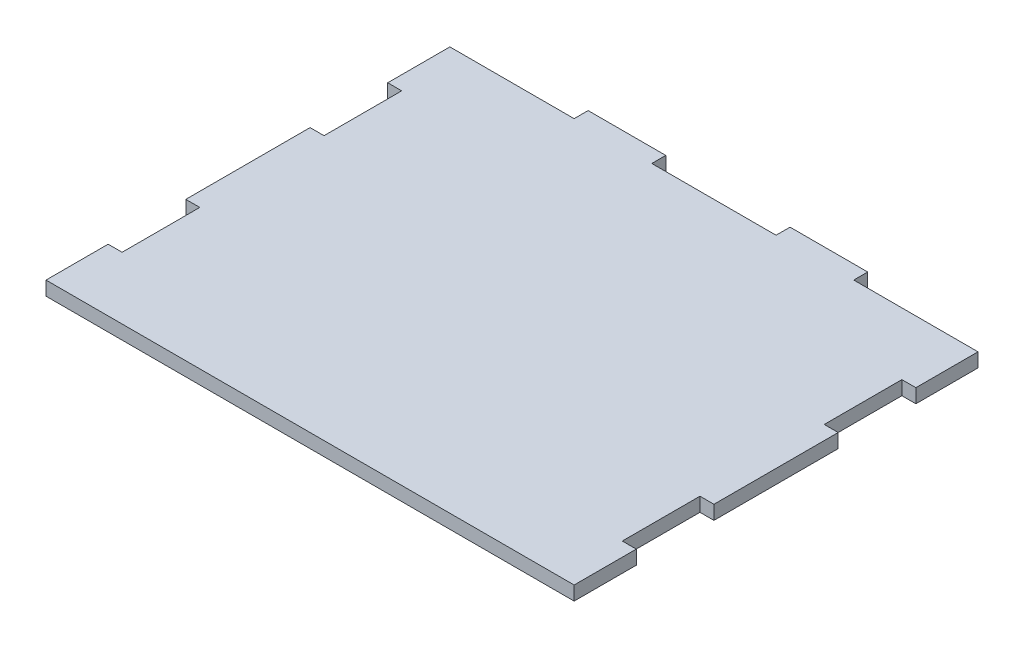
ISO-10303-21;
HEADER;
FILE_DESCRIPTION(('STEP AP214'),'2;1');
FILE_NAME('part.step','',(''),(''),'','','');
FILE_SCHEMA(('AUTOMOTIVE_DESIGN { 1 0 10303 214 1 1 1 1 }'));
ENDSEC;
DATA;
#1=APPLICATION_CONTEXT('core data for automotive mechanical design processes');
#2=APPLICATION_PROTOCOL_DEFINITION('international standard','automotive_design',2000,#1);
#3=PRODUCT_CONTEXT('',#1,'mechanical');
#4=PRODUCT('Part','Part','',(#3));
#5=PRODUCT_RELATED_PRODUCT_CATEGORY('part','',(#4));
#6=PRODUCT_DEFINITION_FORMATION('','',#4);
#7=PRODUCT_DEFINITION_CONTEXT('part definition',#1,'design');
#8=PRODUCT_DEFINITION('design','',#6,#7);
#9=PRODUCT_DEFINITION_SHAPE('','',#8);
#10=(LENGTH_UNIT() NAMED_UNIT(*) SI_UNIT(.MILLI.,.METRE.));
#11=(NAMED_UNIT(*) PLANE_ANGLE_UNIT() SI_UNIT($,.RADIAN.));
#12=(NAMED_UNIT(*) SI_UNIT($,.STERADIAN.) SOLID_ANGLE_UNIT());
#13=UNCERTAINTY_MEASURE_WITH_UNIT(LENGTH_MEASURE(1.E-05),#10,'distance_accuracy_value','');
#14=(GEOMETRIC_REPRESENTATION_CONTEXT(3) GLOBAL_UNCERTAINTY_ASSIGNED_CONTEXT((#13)) GLOBAL_UNIT_ASSIGNED_CONTEXT((#10,
#11,#12)) REPRESENTATION_CONTEXT('',''));
#15=CARTESIAN_POINT('',(0.,0.,0.));
#16=DIRECTION('',(0.,0.,1.));
#17=DIRECTION('',(1.,0.,0.));
#18=AXIS2_PLACEMENT_3D('',#15,#16,#17);
#19=CARTESIAN_POINT('',(-91.4466292134831,4.5,-35.6952247191011));
#20=DIRECTION('',(1.,0.,0.));
#21=DIRECTION('',(0.,0.,-1.));
#22=AXIS2_PLACEMENT_3D('',#19,#20,#21);
#23=PLANE('',#22);
#24=DIRECTION('',(0.,0.,1.));
#25=VECTOR('',#24,1.);
#26=CARTESIAN_POINT('',(-91.4466292134831,0.,-35.6952247191011));
#27=LINE('',#26,#25);
#28=CARTESIAN_POINT('',(-91.4466292134831,0.,-35.6952247191011));
#29=VERTEX_POINT('',#28);
#30=CARTESIAN_POINT('',(-91.4466292134831,0.,-15.6952247191011));
#31=VERTEX_POINT('',#30);
#32=EDGE_CURVE('E249',#29,#31,#27,.T.);
#33=ORIENTED_EDGE('',*,*,#32,.T.);
#34=DIRECTION('',(0.,-1.,0.));
#35=VECTOR('',#34,1.);
#36=CARTESIAN_POINT('',(-91.4466292134831,4.5,-15.6952247191011));
#37=LINE('',#36,#35);
#38=CARTESIAN_POINT('',(-91.4466292134831,4.5,-15.6952247191011));
#39=VERTEX_POINT('',#38);
#40=EDGE_CURVE('E11',#39,#31,#37,.T.);
#41=ORIENTED_EDGE('',*,*,#40,.F.);
#42=DIRECTION('',(0.,0.,1.));
#43=VECTOR('',#42,1.);
#44=CARTESIAN_POINT('',(-91.4466292134831,4.5,-35.6952247191011));
#45=LINE('',#44,#43);
#46=CARTESIAN_POINT('',(-91.4466292134831,4.5,-35.6952247191011));
#47=VERTEX_POINT('',#46);
#48=EDGE_CURVE('E303',#47,#39,#45,.T.);
#49=ORIENTED_EDGE('',*,*,#48,.F.);
#50=DIRECTION('',(0.,-1.,0.));
#51=VECTOR('',#50,1.);
#52=CARTESIAN_POINT('',(-91.4466292134831,4.5,-35.6952247191011));
#53=LINE('',#52,#51);
#54=EDGE_CURVE('E245',#47,#29,#53,.T.);
#55=ORIENTED_EDGE('',*,*,#54,.T.);
#56=EDGE_LOOP('',(#33,#41,#49,#55));
#57=FACE_BOUND('',#56,.T.);
#58=ADVANCED_FACE('F33',(#57),#23,.F.);
#59=CARTESIAN_POINT('',(-91.4466292134831,4.5,-15.6952247191011));
#60=DIRECTION('',(0.,0.,-1.));
#61=DIRECTION('',(-1.,0.,0.));
#62=AXIS2_PLACEMENT_3D('',#59,#60,#61);
#63=PLANE('',#62);
#64=DIRECTION('',(1.,0.,0.));
#65=VECTOR('',#64,1.);
#66=CARTESIAN_POINT('',(-91.4466292134831,0.,-15.6952247191011));
#67=LINE('',#66,#65);
#68=CARTESIAN_POINT('',(-86.9466292134831,0.,-15.6952247191011));
#69=VERTEX_POINT('',#68);
#70=EDGE_CURVE('E252',#31,#69,#67,.T.);
#71=ORIENTED_EDGE('',*,*,#70,.T.);
#72=DIRECTION('',(0.,-1.,0.));
#73=VECTOR('',#72,1.);
#74=CARTESIAN_POINT('',(-86.9466292134831,4.5,-15.6952247191011));
#75=LINE('',#74,#73);
#76=CARTESIAN_POINT('',(-86.9466292134831,4.5,-15.6952247191011));
#77=VERTEX_POINT('',#76);
#78=EDGE_CURVE('E41',#77,#69,#75,.T.);
#79=ORIENTED_EDGE('',*,*,#78,.F.);
#80=DIRECTION('',(1.,0.,0.));
#81=VECTOR('',#80,1.);
#82=CARTESIAN_POINT('',(-91.4466292134831,4.5,-15.6952247191011));
#83=LINE('',#82,#81);
#84=EDGE_CURVE('E152',#39,#77,#83,.T.);
#85=ORIENTED_EDGE('',*,*,#84,.F.);
#86=ORIENTED_EDGE('',*,*,#40,.T.);
#87=EDGE_LOOP('',(#71,#79,#85,#86));
#88=FACE_BOUND('',#87,.T.);
#89=ADVANCED_FACE('F461',(#88),#63,.F.);
#90=CARTESIAN_POINT('',(-86.9466292134831,4.5,-15.6952247191011));
#91=DIRECTION('',(1.,0.,0.));
#92=DIRECTION('',(0.,0.,-1.));
#93=AXIS2_PLACEMENT_3D('',#90,#91,#92);
#94=PLANE('',#93);
#95=DIRECTION('',(0.,0.,1.));
#96=VECTOR('',#95,1.);
#97=CARTESIAN_POINT('',(-86.9466292134831,0.,-15.6952247191011));
#98=LINE('',#97,#96);
#99=CARTESIAN_POINT('',(-86.9466292134831,0.,9.30477528089887));
#100=VERTEX_POINT('',#99);
#101=EDGE_CURVE('E254',#69,#100,#98,.T.);
#102=ORIENTED_EDGE('',*,*,#101,.T.);
#103=DIRECTION('',(0.,-1.,0.));
#104=VECTOR('',#103,1.);
#105=CARTESIAN_POINT('',(-86.9466292134831,4.5,9.30477528089887));
#106=LINE('',#105,#104);
#107=CARTESIAN_POINT('',(-86.9466292134831,4.5,9.30477528089887));
#108=VERTEX_POINT('',#107);
#109=EDGE_CURVE('E370',#108,#100,#106,.T.);
#110=ORIENTED_EDGE('',*,*,#109,.F.);
#111=DIRECTION('',(0.,0.,1.));
#112=VECTOR('',#111,1.);
#113=CARTESIAN_POINT('',(-86.9466292134831,4.5,-15.6952247191011));
#114=LINE('',#113,#112);
#115=EDGE_CURVE('E378',#77,#108,#114,.T.);
#116=ORIENTED_EDGE('',*,*,#115,.F.);
#117=ORIENTED_EDGE('',*,*,#78,.T.);
#118=EDGE_LOOP('',(#102,#110,#116,#117));
#119=FACE_BOUND('',#118,.T.);
#120=ADVANCED_FACE('F376',(#119),#94,.F.);
#121=CARTESIAN_POINT('',(-91.4466292134832,4.5,9.30477528089887));
#122=DIRECTION('',(0.,0.,1.));
#123=DIRECTION('',(1.,0.,0.));
#124=AXIS2_PLACEMENT_3D('',#121,#122,#123);
#125=PLANE('',#124);
#126=DIRECTION('',(-1.,0.,0.));
#127=VECTOR('',#126,1.);
#128=CARTESIAN_POINT('',(-91.4466292134832,0.,9.30477528089887));
#129=LINE('',#128,#127);
#130=CARTESIAN_POINT('',(-91.4466292134832,0.,9.30477528089887));
#131=VERTEX_POINT('',#130);
#132=EDGE_CURVE('E256',#100,#131,#129,.T.);
#133=ORIENTED_EDGE('',*,*,#132,.T.);
#134=DIRECTION('',(0.,-1.,0.));
#135=VECTOR('',#134,1.);
#136=CARTESIAN_POINT('',(-91.4466292134832,4.5,9.30477528089887));
#137=LINE('',#136,#135);
#138=CARTESIAN_POINT('',(-91.4466292134832,4.5,9.30477528089887));
#139=VERTEX_POINT('',#138);
#140=EDGE_CURVE('E367',#139,#131,#137,.T.);
#141=ORIENTED_EDGE('',*,*,#140,.F.);
#142=DIRECTION('',(-1.,0.,0.));
#143=VECTOR('',#142,1.);
#144=CARTESIAN_POINT('',(-91.4466292134832,4.5,9.30477528089887));
#145=LINE('',#144,#143);
#146=EDGE_CURVE('E396',#108,#139,#145,.T.);
#147=ORIENTED_EDGE('',*,*,#146,.F.);
#148=ORIENTED_EDGE('',*,*,#109,.T.);
#149=EDGE_LOOP('',(#133,#141,#147,#148));
#150=FACE_BOUND('',#149,.T.);
#151=ADVANCED_FACE('F387',(#150),#125,.F.);
#152=CARTESIAN_POINT('',(-91.4466292134832,4.5,9.30477528089887));
#153=DIRECTION('',(1.,0.,0.));
#154=DIRECTION('',(0.,0.,-1.));
#155=AXIS2_PLACEMENT_3D('',#152,#153,#154);
#156=PLANE('',#155);
#157=DIRECTION('',(0.,0.,1.));
#158=VECTOR('',#157,1.);
#159=CARTESIAN_POINT('',(-91.4466292134832,0.,9.30477528089887));
#160=LINE('',#159,#158);
#161=CARTESIAN_POINT('',(-91.4466292134832,0.,49.3047752808989));
#162=VERTEX_POINT('',#161);
#163=EDGE_CURVE('E258',#131,#162,#160,.T.);
#164=ORIENTED_EDGE('',*,*,#163,.T.);
#165=DIRECTION('',(0.,-1.,0.));
#166=VECTOR('',#165,1.);
#167=CARTESIAN_POINT('',(-91.4466292134832,4.5,49.3047752808989));
#168=LINE('',#167,#166);
#169=CARTESIAN_POINT('',(-91.4466292134832,4.5,49.3047752808989));
#170=VERTEX_POINT('',#169);
#171=EDGE_CURVE('E364',#170,#162,#168,.T.);
#172=ORIENTED_EDGE('',*,*,#171,.F.);
#173=DIRECTION('',(0.,0.,1.));
#174=VECTOR('',#173,1.);
#175=CARTESIAN_POINT('',(-91.4466292134832,4.5,9.30477528089887));
#176=LINE('',#175,#174);
#177=EDGE_CURVE('E393',#139,#170,#176,.T.);
#178=ORIENTED_EDGE('',*,*,#177,.F.);
#179=ORIENTED_EDGE('',*,*,#140,.T.);
#180=EDGE_LOOP('',(#164,#172,#178,#179));
#181=FACE_BOUND('',#180,.T.);
#182=ADVANCED_FACE('F391',(#181),#156,.F.);
#183=CARTESIAN_POINT('',(-91.4466292134832,4.5,49.3047752808989));
#184=DIRECTION('',(0.,0.,-1.));
#185=DIRECTION('',(-1.,0.,0.));
#186=AXIS2_PLACEMENT_3D('',#183,#184,#185);
#187=PLANE('',#186);
#188=DIRECTION('',(1.,0.,0.));
#189=VECTOR('',#188,1.);
#190=CARTESIAN_POINT('',(-91.4466292134832,0.,49.3047752808989));
#191=LINE('',#190,#189);
#192=CARTESIAN_POINT('',(-86.9466292134831,0.,49.3047752808989));
#193=VERTEX_POINT('',#192);
#194=EDGE_CURVE('E260',#162,#193,#191,.T.);
#195=ORIENTED_EDGE('',*,*,#194,.T.);
#196=DIRECTION('',(0.,-1.,0.));
#197=VECTOR('',#196,1.);
#198=CARTESIAN_POINT('',(-86.9466292134831,4.5,49.3047752808989));
#199=LINE('',#198,#197);
#200=CARTESIAN_POINT('',(-86.9466292134831,4.5,49.3047752808989));
#201=VERTEX_POINT('',#200);
#202=EDGE_CURVE('E361',#201,#193,#199,.T.);
#203=ORIENTED_EDGE('',*,*,#202,.F.);
#204=DIRECTION('',(1.,0.,0.));
#205=VECTOR('',#204,1.);
#206=CARTESIAN_POINT('',(-91.4466292134832,4.5,49.3047752808989));
#207=LINE('',#206,#205);
#208=EDGE_CURVE('E395',#170,#201,#207,.T.);
#209=ORIENTED_EDGE('',*,*,#208,.F.);
#210=ORIENTED_EDGE('',*,*,#171,.T.);
#211=EDGE_LOOP('',(#195,#203,#209,#210));
#212=FACE_BOUND('',#211,.T.);
#213=ADVANCED_FACE('F474',(#212),#187,.F.);
#214=CARTESIAN_POINT('',(-86.9466292134831,4.5,74.3047752808989));
#215=DIRECTION('',(1.,0.,0.));
#216=DIRECTION('',(0.,0.,-1.));
#217=AXIS2_PLACEMENT_3D('',#214,#215,#216);
#218=PLANE('',#217);
#219=DIRECTION('',(0.,0.,1.));
#220=VECTOR('',#219,1.);
#221=CARTESIAN_POINT('',(-86.9466292134831,0.,74.3047752808989));
#222=LINE('',#221,#220);
#223=CARTESIAN_POINT('',(-86.9466292134831,0.,74.3047752808989));
#224=VERTEX_POINT('',#223);
#225=EDGE_CURVE('E262',#193,#224,#222,.T.);
#226=ORIENTED_EDGE('',*,*,#225,.T.);
#227=DIRECTION('',(0.,-1.,0.));
#228=VECTOR('',#227,1.);
#229=CARTESIAN_POINT('',(-86.9466292134831,4.5,74.3047752808989));
#230=LINE('',#229,#228);
#231=CARTESIAN_POINT('',(-86.9466292134831,4.5,74.3047752808989));
#232=VERTEX_POINT('',#231);
#233=EDGE_CURVE('E358',#232,#224,#230,.T.);
#234=ORIENTED_EDGE('',*,*,#233,.F.);
#235=DIRECTION('',(0.,0.,1.));
#236=VECTOR('',#235,1.);
#237=CARTESIAN_POINT('',(-86.9466292134831,4.5,74.3047752808989));
#238=LINE('',#237,#236);
#239=EDGE_CURVE('E398',#201,#232,#238,.T.);
#240=ORIENTED_EDGE('',*,*,#239,.F.);
#241=ORIENTED_EDGE('',*,*,#202,.T.);
#242=EDGE_LOOP('',(#226,#234,#240,#241));
#243=FACE_BOUND('',#242,.T.);
#244=ADVANCED_FACE('F477',(#243),#218,.F.);
#245=CARTESIAN_POINT('',(-91.4466292134831,4.5,74.3047752808989));
#246=DIRECTION('',(0.,0.,1.));
#247=DIRECTION('',(1.,0.,0.));
#248=AXIS2_PLACEMENT_3D('',#245,#246,#247);
#249=PLANE('',#248);
#250=DIRECTION('',(-1.,0.,0.));
#251=VECTOR('',#250,1.);
#252=CARTESIAN_POINT('',(-91.4466292134831,0.,74.3047752808989));
#253=LINE('',#252,#251);
#254=CARTESIAN_POINT('',(-91.4466292134831,0.,74.3047752808989));
#255=VERTEX_POINT('',#254);
#256=EDGE_CURVE('E264',#224,#255,#253,.T.);
#257=ORIENTED_EDGE('',*,*,#256,.T.);
#258=DIRECTION('',(0.,-1.,0.));
#259=VECTOR('',#258,1.);
#260=CARTESIAN_POINT('',(-91.4466292134831,4.5,74.3047752808989));
#261=LINE('',#260,#259);
#262=CARTESIAN_POINT('',(-91.4466292134831,4.5,74.3047752808989));
#263=VERTEX_POINT('',#262);
#264=EDGE_CURVE('E355',#263,#255,#261,.T.);
#265=ORIENTED_EDGE('',*,*,#264,.F.);
#266=DIRECTION('',(-1.,0.,0.));
#267=VECTOR('',#266,1.);
#268=CARTESIAN_POINT('',(-91.4466292134831,4.5,74.3047752808989));
#269=LINE('',#268,#267);
#270=EDGE_CURVE('E404',#232,#263,#269,.T.);
#271=ORIENTED_EDGE('',*,*,#270,.F.);
#272=ORIENTED_EDGE('',*,*,#233,.T.);
#273=EDGE_LOOP('',(#257,#265,#271,#272));
#274=FACE_BOUND('',#273,.T.);
#275=ADVANCED_FACE('F481',(#274),#249,.F.);
#276=CARTESIAN_POINT('',(-91.4466292134831,4.5,74.3047752808989));
#277=DIRECTION('',(1.,0.,0.));
#278=DIRECTION('',(0.,0.,-1.));
#279=AXIS2_PLACEMENT_3D('',#276,#277,#278);
#280=PLANE('',#279);
#281=DIRECTION('',(0.,0.,1.));
#282=VECTOR('',#281,1.);
#283=CARTESIAN_POINT('',(-91.4466292134831,0.,74.3047752808989));
#284=LINE('',#283,#282);
#285=CARTESIAN_POINT('',(-91.4466292134831,0.,94.3047752808989));
#286=VERTEX_POINT('',#285);
#287=EDGE_CURVE('E266',#255,#286,#284,.T.);
#288=ORIENTED_EDGE('',*,*,#287,.T.);
#289=DIRECTION('',(0.,-1.,0.));
#290=VECTOR('',#289,1.);
#291=CARTESIAN_POINT('',(-91.4466292134831,4.5,94.3047752808989));
#292=LINE('',#291,#290);
#293=CARTESIAN_POINT('',(-91.4466292134831,4.5,94.3047752808989));
#294=VERTEX_POINT('',#293);
#295=EDGE_CURVE('E352',#294,#286,#292,.T.);
#296=ORIENTED_EDGE('',*,*,#295,.F.);
#297=DIRECTION('',(0.,0.,1.));
#298=VECTOR('',#297,1.);
#299=CARTESIAN_POINT('',(-91.4466292134831,4.5,74.3047752808989));
#300=LINE('',#299,#298);
#301=EDGE_CURVE('E406',#263,#294,#300,.T.);
#302=ORIENTED_EDGE('',*,*,#301,.F.);
#303=ORIENTED_EDGE('',*,*,#264,.T.);
#304=EDGE_LOOP('',(#288,#296,#302,#303));
#305=FACE_BOUND('',#304,.T.);
#306=ADVANCED_FACE('F485',(#305),#280,.F.);
#307=CARTESIAN_POINT('',(-91.4466292134831,4.5,94.3047752808989));
#308=DIRECTION('',(0.,0.,-1.));
#309=DIRECTION('',(-1.,0.,0.));
#310=AXIS2_PLACEMENT_3D('',#307,#308,#309);
#311=PLANE('',#310);
#312=DIRECTION('',(1.,0.,0.));
#313=VECTOR('',#312,1.);
#314=CARTESIAN_POINT('',(-91.4466292134831,0.,94.3047752808989));
#315=LINE('',#314,#313);
#316=CARTESIAN_POINT('',(78.5533707865169,0.,94.3047752808989));
#317=VERTEX_POINT('',#316);
#318=EDGE_CURVE('E268',#286,#317,#315,.T.);
#319=ORIENTED_EDGE('',*,*,#318,.T.);
#320=DIRECTION('',(0.,-1.,0.));
#321=VECTOR('',#320,1.);
#322=CARTESIAN_POINT('',(78.5533707865169,4.5,94.3047752808989));
#323=LINE('',#322,#321);
#324=CARTESIAN_POINT('',(78.5533707865169,4.5,94.3047752808989));
#325=VERTEX_POINT('',#324);
#326=EDGE_CURVE('E349',#325,#317,#323,.T.);
#327=ORIENTED_EDGE('',*,*,#326,.F.);
#328=DIRECTION('',(1.,0.,0.));
#329=VECTOR('',#328,1.);
#330=CARTESIAN_POINT('',(-91.4466292134831,4.5,94.3047752808989));
#331=LINE('',#330,#329);
#332=EDGE_CURVE('E408',#294,#325,#331,.T.);
#333=ORIENTED_EDGE('',*,*,#332,.F.);
#334=ORIENTED_EDGE('',*,*,#295,.T.);
#335=EDGE_LOOP('',(#319,#327,#333,#334));
#336=FACE_BOUND('',#335,.T.);
#337=ADVANCED_FACE('F489',(#336),#311,.F.);
#338=CARTESIAN_POINT('',(78.5533707865169,4.5,74.3047752808988));
#339=DIRECTION('',(-1.,0.,0.));
#340=DIRECTION('',(0.,0.,1.));
#341=AXIS2_PLACEMENT_3D('',#338,#339,#340);
#342=PLANE('',#341);
#343=DIRECTION('',(0.,0.,-1.));
#344=VECTOR('',#343,1.);
#345=CARTESIAN_POINT('',(78.5533707865169,0.,74.3047752808988));
#346=LINE('',#345,#344);
#347=CARTESIAN_POINT('',(78.5533707865169,0.,74.3047752808988));
#348=VERTEX_POINT('',#347);
#349=EDGE_CURVE('E270',#317,#348,#346,.T.);
#350=ORIENTED_EDGE('',*,*,#349,.T.);
#351=DIRECTION('',(0.,-1.,0.));
#352=VECTOR('',#351,1.);
#353=CARTESIAN_POINT('',(78.5533707865169,4.5,74.3047752808988));
#354=LINE('',#353,#352);
#355=CARTESIAN_POINT('',(78.5533707865169,4.5,74.3047752808988));
#356=VERTEX_POINT('',#355);
#357=EDGE_CURVE('E346',#356,#348,#354,.T.);
#358=ORIENTED_EDGE('',*,*,#357,.F.);
#359=DIRECTION('',(0.,0.,-1.));
#360=VECTOR('',#359,1.);
#361=CARTESIAN_POINT('',(78.5533707865169,4.5,74.3047752808988));
#362=LINE('',#361,#360);
#363=EDGE_CURVE('E410',#325,#356,#362,.T.);
#364=ORIENTED_EDGE('',*,*,#363,.F.);
#365=ORIENTED_EDGE('',*,*,#326,.T.);
#366=EDGE_LOOP('',(#350,#358,#364,#365));
#367=FACE_BOUND('',#366,.T.);
#368=ADVANCED_FACE('F493',(#367),#342,.F.);
#369=CARTESIAN_POINT('',(78.5533707865169,4.5,74.3047752808988));
#370=DIRECTION('',(0.,0.,1.));
#371=DIRECTION('',(1.,0.,0.));
#372=AXIS2_PLACEMENT_3D('',#369,#370,#371);
#373=PLANE('',#372);
#374=DIRECTION('',(-1.,0.,0.));
#375=VECTOR('',#374,1.);
#376=CARTESIAN_POINT('',(78.5533707865169,0.,74.3047752808988));
#377=LINE('',#376,#375);
#378=CARTESIAN_POINT('',(74.0533707865169,0.,74.3047752808988));
#379=VERTEX_POINT('',#378);
#380=EDGE_CURVE('E272',#348,#379,#377,.T.);
#381=ORIENTED_EDGE('',*,*,#380,.T.);
#382=DIRECTION('',(0.,-1.,0.));
#383=VECTOR('',#382,1.);
#384=CARTESIAN_POINT('',(74.0533707865169,4.5,74.3047752808988));
#385=LINE('',#384,#383);
#386=CARTESIAN_POINT('',(74.0533707865169,4.5,74.3047752808988));
#387=VERTEX_POINT('',#386);
#388=EDGE_CURVE('E343',#387,#379,#385,.T.);
#389=ORIENTED_EDGE('',*,*,#388,.F.);
#390=DIRECTION('',(-1.,0.,0.));
#391=VECTOR('',#390,1.);
#392=CARTESIAN_POINT('',(78.5533707865169,4.5,74.3047752808988));
#393=LINE('',#392,#391);
#394=EDGE_CURVE('E412',#356,#387,#393,.T.);
#395=ORIENTED_EDGE('',*,*,#394,.F.);
#396=ORIENTED_EDGE('',*,*,#357,.T.);
#397=EDGE_LOOP('',(#381,#389,#395,#396));
#398=FACE_BOUND('',#397,.T.);
#399=ADVANCED_FACE('F497',(#398),#373,.F.);
#400=CARTESIAN_POINT('',(74.0533707865169,4.5,74.3047752808988));
#401=DIRECTION('',(-1.,0.,0.));
#402=DIRECTION('',(0.,0.,1.));
#403=AXIS2_PLACEMENT_3D('',#400,#401,#402);
#404=PLANE('',#403);
#405=DIRECTION('',(0.,0.,-1.));
#406=VECTOR('',#405,1.);
#407=CARTESIAN_POINT('',(74.0533707865169,0.,74.3047752808988));
#408=LINE('',#407,#406);
#409=CARTESIAN_POINT('',(74.0533707865169,0.,49.3047752808988));
#410=VERTEX_POINT('',#409);
#411=EDGE_CURVE('E274',#379,#410,#408,.T.);
#412=ORIENTED_EDGE('',*,*,#411,.T.);
#413=DIRECTION('',(0.,-1.,0.));
#414=VECTOR('',#413,1.);
#415=CARTESIAN_POINT('',(74.0533707865169,4.5,49.3047752808988));
#416=LINE('',#415,#414);
#417=CARTESIAN_POINT('',(74.0533707865169,4.5,49.3047752808988));
#418=VERTEX_POINT('',#417);
#419=EDGE_CURVE('E340',#418,#410,#416,.T.);
#420=ORIENTED_EDGE('',*,*,#419,.F.);
#421=DIRECTION('',(0.,0.,-1.));
#422=VECTOR('',#421,1.);
#423=CARTESIAN_POINT('',(74.0533707865169,4.5,74.3047752808988));
#424=LINE('',#423,#422);
#425=EDGE_CURVE('E414',#387,#418,#424,.T.);
#426=ORIENTED_EDGE('',*,*,#425,.F.);
#427=ORIENTED_EDGE('',*,*,#388,.T.);
#428=EDGE_LOOP('',(#412,#420,#426,#427));
#429=FACE_BOUND('',#428,.T.);
#430=ADVANCED_FACE('F501',(#429),#404,.F.);
#431=CARTESIAN_POINT('',(78.5533707865169,4.5,49.3047752808988));
#432=DIRECTION('',(0.,0.,-1.));
#433=DIRECTION('',(-1.,0.,0.));
#434=AXIS2_PLACEMENT_3D('',#431,#432,#433);
#435=PLANE('',#434);
#436=DIRECTION('',(1.,0.,0.));
#437=VECTOR('',#436,1.);
#438=CARTESIAN_POINT('',(78.5533707865169,0.,49.3047752808988));
#439=LINE('',#438,#437);
#440=CARTESIAN_POINT('',(78.5533707865169,0.,49.3047752808988));
#441=VERTEX_POINT('',#440);
#442=EDGE_CURVE('E276',#410,#441,#439,.T.);
#443=ORIENTED_EDGE('',*,*,#442,.T.);
#444=DIRECTION('',(0.,-1.,0.));
#445=VECTOR('',#444,1.);
#446=CARTESIAN_POINT('',(78.5533707865169,4.5,49.3047752808988));
#447=LINE('',#446,#445);
#448=CARTESIAN_POINT('',(78.5533707865169,4.5,49.3047752808988));
#449=VERTEX_POINT('',#448);
#450=EDGE_CURVE('E337',#449,#441,#447,.T.);
#451=ORIENTED_EDGE('',*,*,#450,.F.);
#452=DIRECTION('',(1.,0.,0.));
#453=VECTOR('',#452,1.);
#454=CARTESIAN_POINT('',(78.5533707865169,4.5,49.3047752808988));
#455=LINE('',#454,#453);
#456=EDGE_CURVE('E416',#418,#449,#455,.T.);
#457=ORIENTED_EDGE('',*,*,#456,.F.);
#458=ORIENTED_EDGE('',*,*,#419,.T.);
#459=EDGE_LOOP('',(#443,#451,#457,#458));
#460=FACE_BOUND('',#459,.T.);
#461=ADVANCED_FACE('F505',(#460),#435,.F.);
#462=CARTESIAN_POINT('',(78.5533707865169,4.5,9.30477528089885));
#463=DIRECTION('',(-1.,0.,0.));
#464=DIRECTION('',(0.,0.,1.));
#465=AXIS2_PLACEMENT_3D('',#462,#463,#464);
#466=PLANE('',#465);
#467=DIRECTION('',(0.,0.,-1.));
#468=VECTOR('',#467,1.);
#469=CARTESIAN_POINT('',(78.5533707865169,0.,9.30477528089885));
#470=LINE('',#469,#468);
#471=CARTESIAN_POINT('',(78.5533707865169,0.,9.30477528089885));
#472=VERTEX_POINT('',#471);
#473=EDGE_CURVE('E278',#441,#472,#470,.T.);
#474=ORIENTED_EDGE('',*,*,#473,.T.);
#475=DIRECTION('',(0.,-1.,0.));
#476=VECTOR('',#475,1.);
#477=CARTESIAN_POINT('',(78.5533707865169,4.5,9.30477528089885));
#478=LINE('',#477,#476);
#479=CARTESIAN_POINT('',(78.5533707865169,4.5,9.30477528089885));
#480=VERTEX_POINT('',#479);
#481=EDGE_CURVE('E334',#480,#472,#478,.T.);
#482=ORIENTED_EDGE('',*,*,#481,.F.);
#483=DIRECTION('',(0.,0.,-1.));
#484=VECTOR('',#483,1.);
#485=CARTESIAN_POINT('',(78.5533707865169,4.5,9.30477528089885));
#486=LINE('',#485,#484);
#487=EDGE_CURVE('E418',#449,#480,#486,.T.);
#488=ORIENTED_EDGE('',*,*,#487,.F.);
#489=ORIENTED_EDGE('',*,*,#450,.T.);
#490=EDGE_LOOP('',(#474,#482,#488,#489));
#491=FACE_BOUND('',#490,.T.);
#492=ADVANCED_FACE('F509',(#491),#466,.F.);
#493=CARTESIAN_POINT('',(78.5533707865169,4.5,9.30477528089885));
#494=DIRECTION('',(0.,0.,1.));
#495=DIRECTION('',(1.,0.,0.));
#496=AXIS2_PLACEMENT_3D('',#493,#494,#495);
#497=PLANE('',#496);
#498=DIRECTION('',(-1.,0.,0.));
#499=VECTOR('',#498,1.);
#500=CARTESIAN_POINT('',(78.5533707865169,0.,9.30477528089885));
#501=LINE('',#500,#499);
#502=CARTESIAN_POINT('',(74.0533707865169,0.,9.30477528089885));
#503=VERTEX_POINT('',#502);
#504=EDGE_CURVE('E280',#472,#503,#501,.T.);
#505=ORIENTED_EDGE('',*,*,#504,.T.);
#506=DIRECTION('',(0.,-1.,0.));
#507=VECTOR('',#506,1.);
#508=CARTESIAN_POINT('',(74.0533707865169,4.5,9.30477528089885));
#509=LINE('',#508,#507);
#510=CARTESIAN_POINT('',(74.0533707865169,4.5,9.30477528089885));
#511=VERTEX_POINT('',#510);
#512=EDGE_CURVE('E331',#511,#503,#509,.T.);
#513=ORIENTED_EDGE('',*,*,#512,.F.);
#514=DIRECTION('',(-1.,0.,0.));
#515=VECTOR('',#514,1.);
#516=CARTESIAN_POINT('',(78.5533707865169,4.5,9.30477528089885));
#517=LINE('',#516,#515);
#518=EDGE_CURVE('E420',#480,#511,#517,.T.);
#519=ORIENTED_EDGE('',*,*,#518,.F.);
#520=ORIENTED_EDGE('',*,*,#481,.T.);
#521=EDGE_LOOP('',(#505,#513,#519,#520));
#522=FACE_BOUND('',#521,.T.);
#523=ADVANCED_FACE('F513',(#522),#497,.F.);
#524=CARTESIAN_POINT('',(74.0533707865169,4.5,-15.6952247191011));
#525=DIRECTION('',(-1.,0.,0.));
#526=DIRECTION('',(0.,0.,1.));
#527=AXIS2_PLACEMENT_3D('',#524,#525,#526);
#528=PLANE('',#527);
#529=DIRECTION('',(0.,0.,-1.));
#530=VECTOR('',#529,1.);
#531=CARTESIAN_POINT('',(74.0533707865169,0.,-15.6952247191011));
#532=LINE('',#531,#530);
#533=CARTESIAN_POINT('',(74.0533707865169,0.,-15.6952247191011));
#534=VERTEX_POINT('',#533);
#535=EDGE_CURVE('E282',#503,#534,#532,.T.);
#536=ORIENTED_EDGE('',*,*,#535,.T.);
#537=DIRECTION('',(0.,-1.,0.));
#538=VECTOR('',#537,1.);
#539=CARTESIAN_POINT('',(74.0533707865169,4.5,-15.6952247191011));
#540=LINE('',#539,#538);
#541=CARTESIAN_POINT('',(74.0533707865169,4.5,-15.6952247191011));
#542=VERTEX_POINT('',#541);
#543=EDGE_CURVE('E328',#542,#534,#540,.T.);
#544=ORIENTED_EDGE('',*,*,#543,.F.);
#545=DIRECTION('',(0.,0.,-1.));
#546=VECTOR('',#545,1.);
#547=CARTESIAN_POINT('',(74.0533707865169,4.5,-15.6952247191011));
#548=LINE('',#547,#546);
#549=EDGE_CURVE('E422',#511,#542,#548,.T.);
#550=ORIENTED_EDGE('',*,*,#549,.F.);
#551=ORIENTED_EDGE('',*,*,#512,.T.);
#552=EDGE_LOOP('',(#536,#544,#550,#551));
#553=FACE_BOUND('',#552,.T.);
#554=ADVANCED_FACE('F517',(#553),#528,.F.);
#555=CARTESIAN_POINT('',(78.5533707865169,4.5,-15.6952247191012));
#556=DIRECTION('',(0.,0.,-1.));
#557=DIRECTION('',(-1.,0.,0.));
#558=AXIS2_PLACEMENT_3D('',#555,#556,#557);
#559=PLANE('',#558);
#560=DIRECTION('',(1.,0.,0.));
#561=VECTOR('',#560,1.);
#562=CARTESIAN_POINT('',(78.5533707865169,0.,-15.6952247191012));
#563=LINE('',#562,#561);
#564=CARTESIAN_POINT('',(78.5533707865169,0.,-15.6952247191012));
#565=VERTEX_POINT('',#564);
#566=EDGE_CURVE('E284',#534,#565,#563,.T.);
#567=ORIENTED_EDGE('',*,*,#566,.T.);
#568=DIRECTION('',(0.,-1.,0.));
#569=VECTOR('',#568,1.);
#570=CARTESIAN_POINT('',(78.5533707865169,4.5,-15.6952247191012));
#571=LINE('',#570,#569);
#572=CARTESIAN_POINT('',(78.5533707865169,4.5,-15.6952247191012));
#573=VERTEX_POINT('',#572);
#574=EDGE_CURVE('E325',#573,#565,#571,.T.);
#575=ORIENTED_EDGE('',*,*,#574,.F.);
#576=DIRECTION('',(1.,0.,0.));
#577=VECTOR('',#576,1.);
#578=CARTESIAN_POINT('',(78.5533707865169,4.5,-15.6952247191012));
#579=LINE('',#578,#577);
#580=EDGE_CURVE('E424',#542,#573,#579,.T.);
#581=ORIENTED_EDGE('',*,*,#580,.F.);
#582=ORIENTED_EDGE('',*,*,#543,.T.);
#583=EDGE_LOOP('',(#567,#575,#581,#582));
#584=FACE_BOUND('',#583,.T.);
#585=ADVANCED_FACE('F521',(#584),#559,.F.);
#586=CARTESIAN_POINT('',(78.5533707865169,4.5,-35.6952247191011));
#587=DIRECTION('',(-1.,0.,0.));
#588=DIRECTION('',(0.,0.,1.));
#589=AXIS2_PLACEMENT_3D('',#586,#587,#588);
#590=PLANE('',#589);
#591=DIRECTION('',(0.,0.,-1.));
#592=VECTOR('',#591,1.);
#593=CARTESIAN_POINT('',(78.5533707865169,0.,-35.6952247191011));
#594=LINE('',#593,#592);
#595=CARTESIAN_POINT('',(78.5533707865169,0.,-35.6952247191011));
#596=VERTEX_POINT('',#595);
#597=EDGE_CURVE('E286',#565,#596,#594,.T.);
#598=ORIENTED_EDGE('',*,*,#597,.T.);
#599=DIRECTION('',(0.,-1.,0.));
#600=VECTOR('',#599,1.);
#601=CARTESIAN_POINT('',(78.5533707865169,4.5,-35.6952247191011));
#602=LINE('',#601,#600);
#603=CARTESIAN_POINT('',(78.5533707865169,4.5,-35.6952247191011));
#604=VERTEX_POINT('',#603);
#605=EDGE_CURVE('E322',#604,#596,#602,.T.);
#606=ORIENTED_EDGE('',*,*,#605,.F.);
#607=DIRECTION('',(0.,0.,-1.));
#608=VECTOR('',#607,1.);
#609=CARTESIAN_POINT('',(78.5533707865169,4.5,-35.6952247191011));
#610=LINE('',#609,#608);
#611=EDGE_CURVE('E426',#573,#604,#610,.T.);
#612=ORIENTED_EDGE('',*,*,#611,.F.);
#613=ORIENTED_EDGE('',*,*,#574,.T.);
#614=EDGE_LOOP('',(#598,#606,#612,#613));
#615=FACE_BOUND('',#614,.T.);
#616=ADVANCED_FACE('F525',(#615),#590,.F.);
#617=CARTESIAN_POINT('',(38.5533707865169,4.5,-35.6952247191011));
#618=DIRECTION('',(0.,0.,1.));
#619=DIRECTION('',(1.,0.,0.));
#620=AXIS2_PLACEMENT_3D('',#617,#618,#619);
#621=PLANE('',#620);
#622=DIRECTION('',(-1.,0.,0.));
#623=VECTOR('',#622,1.);
#624=CARTESIAN_POINT('',(38.5533707865169,0.,-35.6952247191011));
#625=LINE('',#624,#623);
#626=CARTESIAN_POINT('',(38.5533707865169,0.,-35.6952247191011));
#627=VERTEX_POINT('',#626);
#628=EDGE_CURVE('E288',#596,#627,#625,.T.);
#629=ORIENTED_EDGE('',*,*,#628,.T.);
#630=DIRECTION('',(0.,-1.,0.));
#631=VECTOR('',#630,1.);
#632=CARTESIAN_POINT('',(38.5533707865169,4.5,-35.6952247191011));
#633=LINE('',#632,#631);
#634=CARTESIAN_POINT('',(38.5533707865169,4.5,-35.6952247191011));
#635=VERTEX_POINT('',#634);
#636=EDGE_CURVE('E319',#635,#627,#633,.T.);
#637=ORIENTED_EDGE('',*,*,#636,.F.);
#638=DIRECTION('',(-1.,0.,0.));
#639=VECTOR('',#638,1.);
#640=CARTESIAN_POINT('',(38.5533707865169,4.5,-35.6952247191011));
#641=LINE('',#640,#639);
#642=EDGE_CURVE('E428',#604,#635,#641,.T.);
#643=ORIENTED_EDGE('',*,*,#642,.F.);
#644=ORIENTED_EDGE('',*,*,#605,.T.);
#645=EDGE_LOOP('',(#629,#637,#643,#644));
#646=FACE_BOUND('',#645,.T.);
#647=ADVANCED_FACE('F529',(#646),#621,.F.);
#648=CARTESIAN_POINT('',(38.5533707865169,4.5,-35.6952247191011));
#649=DIRECTION('',(-1.,0.,0.));
#650=DIRECTION('',(0.,0.,1.));
#651=AXIS2_PLACEMENT_3D('',#648,#649,#650);
#652=PLANE('',#651);
#653=DIRECTION('',(0.,0.,-1.));
#654=VECTOR('',#653,1.);
#655=CARTESIAN_POINT('',(38.5533707865169,0.,-35.6952247191011));
#656=LINE('',#655,#654);
#657=CARTESIAN_POINT('',(38.5533707865169,0.,-40.1952247191011));
#658=VERTEX_POINT('',#657);
#659=EDGE_CURVE('E290',#627,#658,#656,.T.);
#660=ORIENTED_EDGE('',*,*,#659,.T.);
#661=DIRECTION('',(0.,-1.,0.));
#662=VECTOR('',#661,1.);
#663=CARTESIAN_POINT('',(38.5533707865169,4.5,-40.1952247191011));
#664=LINE('',#663,#662);
#665=CARTESIAN_POINT('',(38.5533707865169,4.5,-40.1952247191011));
#666=VERTEX_POINT('',#665);
#667=EDGE_CURVE('E316',#666,#658,#664,.T.);
#668=ORIENTED_EDGE('',*,*,#667,.F.);
#669=DIRECTION('',(0.,0.,-1.));
#670=VECTOR('',#669,1.);
#671=CARTESIAN_POINT('',(38.5533707865169,4.5,-35.6952247191011));
#672=LINE('',#671,#670);
#673=EDGE_CURVE('E430',#635,#666,#672,.T.);
#674=ORIENTED_EDGE('',*,*,#673,.F.);
#675=ORIENTED_EDGE('',*,*,#636,.T.);
#676=EDGE_LOOP('',(#660,#668,#674,#675));
#677=FACE_BOUND('',#676,.T.);
#678=ADVANCED_FACE('F533',(#677),#652,.F.);
#679=CARTESIAN_POINT('',(38.5533707865169,4.5,-40.1952247191011));
#680=DIRECTION('',(0.,0.,1.));
#681=DIRECTION('',(1.,0.,0.));
#682=AXIS2_PLACEMENT_3D('',#679,#680,#681);
#683=PLANE('',#682);
#684=DIRECTION('',(-1.,0.,0.));
#685=VECTOR('',#684,1.);
#686=CARTESIAN_POINT('',(38.5533707865169,0.,-40.1952247191011));
#687=LINE('',#686,#685);
#688=CARTESIAN_POINT('',(13.5533707865169,0.,-40.1952247191011));
#689=VERTEX_POINT('',#688);
#690=EDGE_CURVE('E292',#658,#689,#687,.T.);
#691=ORIENTED_EDGE('',*,*,#690,.T.);
#692=DIRECTION('',(0.,-1.,0.));
#693=VECTOR('',#692,1.);
#694=CARTESIAN_POINT('',(13.5533707865169,4.5,-40.1952247191011));
#695=LINE('',#694,#693);
#696=CARTESIAN_POINT('',(13.5533707865169,4.5,-40.1952247191011));
#697=VERTEX_POINT('',#696);
#698=EDGE_CURVE('E313',#697,#689,#695,.T.);
#699=ORIENTED_EDGE('',*,*,#698,.F.);
#700=DIRECTION('',(-1.,0.,0.));
#701=VECTOR('',#700,1.);
#702=CARTESIAN_POINT('',(38.5533707865169,4.5,-40.1952247191011));
#703=LINE('',#702,#701);
#704=EDGE_CURVE('E432',#666,#697,#703,.T.);
#705=ORIENTED_EDGE('',*,*,#704,.F.);
#706=ORIENTED_EDGE('',*,*,#667,.T.);
#707=EDGE_LOOP('',(#691,#699,#705,#706));
#708=FACE_BOUND('',#707,.T.);
#709=ADVANCED_FACE('F537',(#708),#683,.F.);
#710=CARTESIAN_POINT('',(13.5533707865169,4.5,-35.6952247191011));
#711=DIRECTION('',(1.,0.,0.));
#712=DIRECTION('',(0.,0.,-1.));
#713=AXIS2_PLACEMENT_3D('',#710,#711,#712);
#714=PLANE('',#713);
#715=DIRECTION('',(0.,0.,1.));
#716=VECTOR('',#715,1.);
#717=CARTESIAN_POINT('',(13.5533707865169,0.,-35.6952247191011));
#718=LINE('',#717,#716);
#719=CARTESIAN_POINT('',(13.5533707865169,0.,-35.6952247191011));
#720=VERTEX_POINT('',#719);
#721=EDGE_CURVE('E294',#689,#720,#718,.T.);
#722=ORIENTED_EDGE('',*,*,#721,.T.);
#723=DIRECTION('',(0.,-1.,0.));
#724=VECTOR('',#723,1.);
#725=CARTESIAN_POINT('',(13.5533707865169,4.5,-35.6952247191011));
#726=LINE('',#725,#724);
#727=CARTESIAN_POINT('',(13.5533707865169,4.5,-35.6952247191011));
#728=VERTEX_POINT('',#727);
#729=EDGE_CURVE('E310',#728,#720,#726,.T.);
#730=ORIENTED_EDGE('',*,*,#729,.F.);
#731=DIRECTION('',(0.,0.,1.));
#732=VECTOR('',#731,1.);
#733=CARTESIAN_POINT('',(13.5533707865169,4.5,-35.6952247191011));
#734=LINE('',#733,#732);
#735=EDGE_CURVE('E434',#697,#728,#734,.T.);
#736=ORIENTED_EDGE('',*,*,#735,.F.);
#737=ORIENTED_EDGE('',*,*,#698,.T.);
#738=EDGE_LOOP('',(#722,#730,#736,#737));
#739=FACE_BOUND('',#738,.T.);
#740=ADVANCED_FACE('F541',(#739),#714,.F.);
#741=CARTESIAN_POINT('',(-26.4466292134832,4.5,-35.6952247191011));
#742=DIRECTION('',(0.,0.,1.));
#743=DIRECTION('',(1.,0.,0.));
#744=AXIS2_PLACEMENT_3D('',#741,#742,#743);
#745=PLANE('',#744);
#746=DIRECTION('',(-1.,0.,0.));
#747=VECTOR('',#746,1.);
#748=CARTESIAN_POINT('',(-26.4466292134832,0.,-35.6952247191011));
#749=LINE('',#748,#747);
#750=CARTESIAN_POINT('',(-26.4466292134832,0.,-35.6952247191011));
#751=VERTEX_POINT('',#750);
#752=EDGE_CURVE('E296',#720,#751,#749,.T.);
#753=ORIENTED_EDGE('',*,*,#752,.T.);
#754=DIRECTION('',(0.,-1.,0.));
#755=VECTOR('',#754,1.);
#756=CARTESIAN_POINT('',(-26.4466292134832,4.5,-35.6952247191011));
#757=LINE('',#756,#755);
#758=CARTESIAN_POINT('',(-26.4466292134832,4.5,-35.6952247191011));
#759=VERTEX_POINT('',#758);
#760=EDGE_CURVE('E307',#759,#751,#757,.T.);
#761=ORIENTED_EDGE('',*,*,#760,.F.);
#762=DIRECTION('',(-1.,0.,0.));
#763=VECTOR('',#762,1.);
#764=CARTESIAN_POINT('',(-26.4466292134832,4.5,-35.6952247191011));
#765=LINE('',#764,#763);
#766=EDGE_CURVE('E436',#728,#759,#765,.T.);
#767=ORIENTED_EDGE('',*,*,#766,.F.);
#768=ORIENTED_EDGE('',*,*,#729,.T.);
#769=EDGE_LOOP('',(#753,#761,#767,#768));
#770=FACE_BOUND('',#769,.T.);
#771=ADVANCED_FACE('F442',(#770),#745,.F.);
#772=CARTESIAN_POINT('',(-26.4466292134832,4.5,-35.6952247191011));
#773=DIRECTION('',(-1.,0.,0.));
#774=DIRECTION('',(0.,0.,1.));
#775=AXIS2_PLACEMENT_3D('',#772,#773,#774);
#776=PLANE('',#775);
#777=DIRECTION('',(0.,0.,-1.));
#778=VECTOR('',#777,1.);
#779=CARTESIAN_POINT('',(-26.4466292134832,0.,-35.6952247191011));
#780=LINE('',#779,#778);
#781=CARTESIAN_POINT('',(-26.4466292134832,0.,-40.1952247191011));
#782=VERTEX_POINT('',#781);
#783=EDGE_CURVE('E298',#751,#782,#780,.T.);
#784=ORIENTED_EDGE('',*,*,#783,.T.);
#785=DIRECTION('',(0.,-1.,0.));
#786=VECTOR('',#785,1.);
#787=CARTESIAN_POINT('',(-26.4466292134832,4.5,-40.1952247191011));
#788=LINE('',#787,#786);
#789=CARTESIAN_POINT('',(-26.4466292134832,4.5,-40.1952247191011));
#790=VERTEX_POINT('',#789);
#791=EDGE_CURVE('E240',#790,#782,#788,.T.);
#792=ORIENTED_EDGE('',*,*,#791,.F.);
#793=DIRECTION('',(0.,0.,-1.));
#794=VECTOR('',#793,1.);
#795=CARTESIAN_POINT('',(-26.4466292134832,4.5,-35.6952247191011));
#796=LINE('',#795,#794);
#797=EDGE_CURVE('E231',#759,#790,#796,.T.);
#798=ORIENTED_EDGE('',*,*,#797,.F.);
#799=ORIENTED_EDGE('',*,*,#760,.T.);
#800=EDGE_LOOP('',(#784,#792,#798,#799));
#801=FACE_BOUND('',#800,.T.);
#802=ADVANCED_FACE('F446',(#801),#776,.F.);
#803=CARTESIAN_POINT('',(-51.4466292134831,4.5,-40.1952247191011));
#804=DIRECTION('',(0.,0.,1.));
#805=DIRECTION('',(1.,0.,0.));
#806=AXIS2_PLACEMENT_3D('',#803,#804,#805);
#807=PLANE('',#806);
#808=DIRECTION('',(-1.,0.,0.));
#809=VECTOR('',#808,1.);
#810=CARTESIAN_POINT('',(-51.4466292134831,0.,-40.1952247191011));
#811=LINE('',#810,#809);
#812=CARTESIAN_POINT('',(-51.4466292134831,0.,-40.1952247191011));
#813=VERTEX_POINT('',#812);
#814=EDGE_CURVE('E239',#782,#813,#811,.T.);
#815=ORIENTED_EDGE('',*,*,#814,.T.);
#816=DIRECTION('',(0.,-1.,0.));
#817=VECTOR('',#816,1.);
#818=CARTESIAN_POINT('',(-51.4466292134831,4.5,-40.1952247191011));
#819=LINE('',#818,#817);
#820=CARTESIAN_POINT('',(-51.4466292134831,4.5,-40.1952247191011));
#821=VERTEX_POINT('',#820);
#822=EDGE_CURVE('E236',#821,#813,#819,.T.);
#823=ORIENTED_EDGE('',*,*,#822,.F.);
#824=DIRECTION('',(-1.,0.,0.));
#825=VECTOR('',#824,1.);
#826=CARTESIAN_POINT('',(-51.4466292134831,4.5,-40.1952247191011));
#827=LINE('',#826,#825);
#828=EDGE_CURVE('E225',#790,#821,#827,.T.);
#829=ORIENTED_EDGE('',*,*,#828,.F.);
#830=ORIENTED_EDGE('',*,*,#791,.T.);
#831=EDGE_LOOP('',(#815,#823,#829,#830));
#832=FACE_BOUND('',#831,.T.);
#833=ADVANCED_FACE('F237',(#832),#807,.F.);
#834=CARTESIAN_POINT('',(-51.4466292134831,4.5,-35.6952247191011));
#835=DIRECTION('',(1.,0.,0.));
#836=DIRECTION('',(0.,0.,-1.));
#837=AXIS2_PLACEMENT_3D('',#834,#835,#836);
#838=PLANE('',#837);
#839=DIRECTION('',(0.,0.,1.));
#840=VECTOR('',#839,1.);
#841=CARTESIAN_POINT('',(-51.4466292134831,0.,-35.6952247191011));
#842=LINE('',#841,#840);
#843=CARTESIAN_POINT('',(-51.4466292134831,0.,-35.6952247191011));
#844=VERTEX_POINT('',#843);
#845=EDGE_CURVE('E138',#813,#844,#842,.T.);
#846=ORIENTED_EDGE('',*,*,#845,.T.);
#847=DIRECTION('',(0.,-1.,0.));
#848=VECTOR('',#847,1.);
#849=CARTESIAN_POINT('',(-51.4466292134831,4.5,-35.6952247191011));
#850=LINE('',#849,#848);
#851=CARTESIAN_POINT('',(-51.4466292134831,4.5,-35.6952247191011));
#852=VERTEX_POINT('',#851);
#853=EDGE_CURVE('E241',#852,#844,#850,.T.);
#854=ORIENTED_EDGE('',*,*,#853,.F.);
#855=DIRECTION('',(0.,0.,1.));
#856=VECTOR('',#855,1.);
#857=CARTESIAN_POINT('',(-51.4466292134831,4.5,-35.6952247191011));
#858=LINE('',#857,#856);
#859=EDGE_CURVE('E229',#821,#852,#858,.T.);
#860=ORIENTED_EDGE('',*,*,#859,.F.);
#861=ORIENTED_EDGE('',*,*,#822,.T.);
#862=EDGE_LOOP('',(#846,#854,#860,#861));
#863=FACE_BOUND('',#862,.T.);
#864=ADVANCED_FACE('F243',(#863),#838,.F.);
#865=CARTESIAN_POINT('',(-91.4466292134831,4.5,-35.6952247191011));
#866=DIRECTION('',(0.,0.,1.));
#867=DIRECTION('',(1.,0.,0.));
#868=AXIS2_PLACEMENT_3D('',#865,#866,#867);
#869=PLANE('',#868);
#870=DIRECTION('',(-1.,0.,0.));
#871=VECTOR('',#870,1.);
#872=CARTESIAN_POINT('',(-91.4466292134831,0.,-35.6952247191011));
#873=LINE('',#872,#871);
#874=EDGE_CURVE('E144',#844,#29,#873,.T.);
#875=ORIENTED_EDGE('',*,*,#874,.T.);
#876=ORIENTED_EDGE('',*,*,#54,.F.);
#877=DIRECTION('',(-1.,0.,0.));
#878=VECTOR('',#877,1.);
#879=CARTESIAN_POINT('',(-91.4466292134831,4.5,-35.6952247191011));
#880=LINE('',#879,#878);
#881=EDGE_CURVE('E49',#852,#47,#880,.T.);
#882=ORIENTED_EDGE('',*,*,#881,.F.);
#883=ORIENTED_EDGE('',*,*,#853,.T.);
#884=EDGE_LOOP('',(#875,#876,#882,#883));
#885=FACE_BOUND('',#884,.T.);
#886=ADVANCED_FACE('F450',(#885),#869,.F.);
#887=CARTESIAN_POINT('',(0.,4.5,0.));
#888=DIRECTION('',(0.,1.,0.));
#889=DIRECTION('',(0.,0.,1.));
#890=AXIS2_PLACEMENT_3D('',#887,#888,#889);
#891=PLANE('',#890);
#892=ORIENTED_EDGE('',*,*,#48,.T.);
#893=ORIENTED_EDGE('',*,*,#84,.T.);
#894=ORIENTED_EDGE('',*,*,#115,.T.);
#895=ORIENTED_EDGE('',*,*,#146,.T.);
#896=ORIENTED_EDGE('',*,*,#177,.T.);
#897=ORIENTED_EDGE('',*,*,#208,.T.);
#898=ORIENTED_EDGE('',*,*,#239,.T.);
#899=ORIENTED_EDGE('',*,*,#270,.T.);
#900=ORIENTED_EDGE('',*,*,#301,.T.);
#901=ORIENTED_EDGE('',*,*,#332,.T.);
#902=ORIENTED_EDGE('',*,*,#363,.T.);
#903=ORIENTED_EDGE('',*,*,#394,.T.);
#904=ORIENTED_EDGE('',*,*,#425,.T.);
#905=ORIENTED_EDGE('',*,*,#456,.T.);
#906=ORIENTED_EDGE('',*,*,#487,.T.);
#907=ORIENTED_EDGE('',*,*,#518,.T.);
#908=ORIENTED_EDGE('',*,*,#549,.T.);
#909=ORIENTED_EDGE('',*,*,#580,.T.);
#910=ORIENTED_EDGE('',*,*,#611,.T.);
#911=ORIENTED_EDGE('',*,*,#642,.T.);
#912=ORIENTED_EDGE('',*,*,#673,.T.);
#913=ORIENTED_EDGE('',*,*,#704,.T.);
#914=ORIENTED_EDGE('',*,*,#735,.T.);
#915=ORIENTED_EDGE('',*,*,#766,.T.);
#916=ORIENTED_EDGE('',*,*,#797,.T.);
#917=ORIENTED_EDGE('',*,*,#828,.T.);
#918=ORIENTED_EDGE('',*,*,#859,.T.);
#919=ORIENTED_EDGE('',*,*,#881,.T.);
#920=EDGE_LOOP('',(#892,#893,#894,#895,#896,#897,#898,#899,#900,#901,#902,#903,#904,#905,#906,
#907,#908,#909,#910,#911,#912,#913,#914,#915,#916,#917,#918,#919));
#921=FACE_BOUND('',#920,.T.);
#922=ADVANCED_FACE('F227',(#921),#891,.T.);
#923=CARTESIAN_POINT('',(0.,0.,0.));
#924=DIRECTION('',(0.,1.,0.));
#925=DIRECTION('',(0.,0.,1.));
#926=AXIS2_PLACEMENT_3D('',#923,#924,#925);
#927=PLANE('',#926);
#928=ORIENTED_EDGE('',*,*,#32,.F.);
#929=ORIENTED_EDGE('',*,*,#874,.F.);
#930=ORIENTED_EDGE('',*,*,#845,.F.);
#931=ORIENTED_EDGE('',*,*,#814,.F.);
#932=ORIENTED_EDGE('',*,*,#783,.F.);
#933=ORIENTED_EDGE('',*,*,#752,.F.);
#934=ORIENTED_EDGE('',*,*,#721,.F.);
#935=ORIENTED_EDGE('',*,*,#690,.F.);
#936=ORIENTED_EDGE('',*,*,#659,.F.);
#937=ORIENTED_EDGE('',*,*,#628,.F.);
#938=ORIENTED_EDGE('',*,*,#597,.F.);
#939=ORIENTED_EDGE('',*,*,#566,.F.);
#940=ORIENTED_EDGE('',*,*,#535,.F.);
#941=ORIENTED_EDGE('',*,*,#504,.F.);
#942=ORIENTED_EDGE('',*,*,#473,.F.);
#943=ORIENTED_EDGE('',*,*,#442,.F.);
#944=ORIENTED_EDGE('',*,*,#411,.F.);
#945=ORIENTED_EDGE('',*,*,#380,.F.);
#946=ORIENTED_EDGE('',*,*,#349,.F.);
#947=ORIENTED_EDGE('',*,*,#318,.F.);
#948=ORIENTED_EDGE('',*,*,#287,.F.);
#949=ORIENTED_EDGE('',*,*,#256,.F.);
#950=ORIENTED_EDGE('',*,*,#225,.F.);
#951=ORIENTED_EDGE('',*,*,#194,.F.);
#952=ORIENTED_EDGE('',*,*,#163,.F.);
#953=ORIENTED_EDGE('',*,*,#132,.F.);
#954=ORIENTED_EDGE('',*,*,#101,.F.);
#955=ORIENTED_EDGE('',*,*,#70,.F.);
#956=EDGE_LOOP('',(#928,#929,#930,#931,#932,#933,#934,#935,#936,#937,#938,#939,#940,#941,#942,
#943,#944,#945,#946,#947,#948,#949,#950,#951,#952,#953,#954,#955));
#957=FACE_BOUND('',#956,.T.);
#958=ADVANCED_FACE('F382',(#957),#927,.F.);
#959=CLOSED_SHELL('',(#58,#89,#120,#151,#182,#213,#244,#275,#306,#337,#368,#399,#430,#461,#492,
#523,#554,#585,#616,#647,#678,#709,#740,#771,#802,#833,#864,#886,#922,#958));
#960=MANIFOLD_SOLID_BREP('B2',#959);
#961=ADVANCED_BREP_SHAPE_REPRESENTATION('',(#18,#960),#14);
#962=SHAPE_DEFINITION_REPRESENTATION(#9,#961);
ENDSEC;
END-ISO-10303-21;
